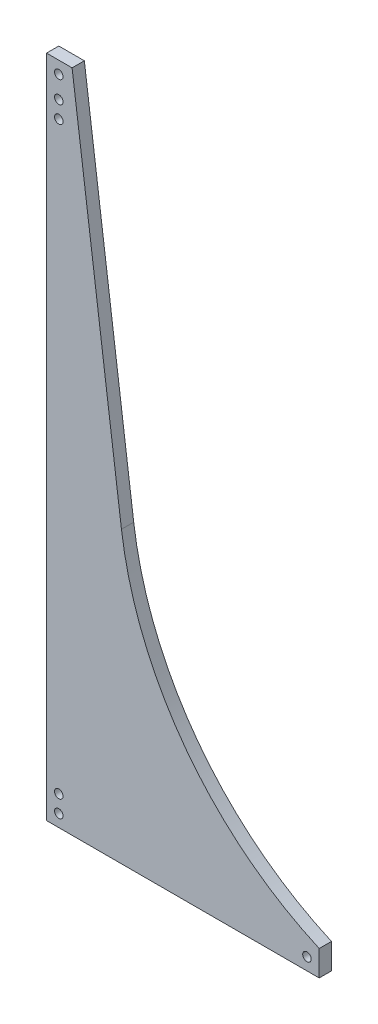
ISO-10303-21;
HEADER;
FILE_DESCRIPTION(('STEP AP214'),'2;1');
FILE_NAME('part.step','',(''),(''),'','','');
FILE_SCHEMA(('AUTOMOTIVE_DESIGN { 1 0 10303 214 1 1 1 1 }'));
ENDSEC;
DATA;
#1=APPLICATION_CONTEXT('core data for automotive mechanical design processes');
#2=APPLICATION_PROTOCOL_DEFINITION('international standard','automotive_design',2000,#1);
#3=PRODUCT_CONTEXT('',#1,'mechanical');
#4=PRODUCT('Part','Part','',(#3));
#5=PRODUCT_RELATED_PRODUCT_CATEGORY('part','',(#4));
#6=PRODUCT_DEFINITION_FORMATION('','',#4);
#7=PRODUCT_DEFINITION_CONTEXT('part definition',#1,'design');
#8=PRODUCT_DEFINITION('design','',#6,#7);
#9=PRODUCT_DEFINITION_SHAPE('','',#8);
#10=(LENGTH_UNIT() NAMED_UNIT(*) SI_UNIT(.MILLI.,.METRE.));
#11=(NAMED_UNIT(*) PLANE_ANGLE_UNIT() SI_UNIT($,.RADIAN.));
#12=(NAMED_UNIT(*) SI_UNIT($,.STERADIAN.) SOLID_ANGLE_UNIT());
#13=UNCERTAINTY_MEASURE_WITH_UNIT(LENGTH_MEASURE(1.E-05),#10,'distance_accuracy_value','');
#14=(GEOMETRIC_REPRESENTATION_CONTEXT(3) GLOBAL_UNCERTAINTY_ASSIGNED_CONTEXT((#13)) GLOBAL_UNIT_ASSIGNED_CONTEXT((#10,
#11,#12)) REPRESENTATION_CONTEXT('',''));
#15=CARTESIAN_POINT('',(0.,0.,0.));
#16=DIRECTION('',(0.,0.,1.));
#17=DIRECTION('',(1.,0.,0.));
#18=AXIS2_PLACEMENT_3D('',#15,#16,#17);
#19=CARTESIAN_POINT('',(0.,0.,9.128125));
#20=DIRECTION('',(1.,0.,0.));
#21=DIRECTION('',(0.,0.,-1.));
#22=AXIS2_PLACEMENT_3D('',#19,#20,#21);
#23=PLANE('',#22);
#24=DIRECTION('',(0.,-1.,0.));
#25=VECTOR('',#24,1.);
#26=CARTESIAN_POINT('',(0.,0.,-9.128125));
#27=LINE('',#26,#25);
#28=CARTESIAN_POINT('',(0.,990.6,-9.128125));
#29=VERTEX_POINT('',#28);
#30=CARTESIAN_POINT('',(0.,0.,-9.128125));
#31=VERTEX_POINT('',#30);
#32=EDGE_CURVE('E128',#29,#31,#27,.T.);
#33=ORIENTED_EDGE('',*,*,#32,.T.);
#34=DIRECTION('',(0.,0.,-1.));
#35=VECTOR('',#34,1.);
#36=CARTESIAN_POINT('',(0.,0.,9.128125));
#37=LINE('',#36,#35);
#38=CARTESIAN_POINT('',(0.,0.,9.128125));
#39=VERTEX_POINT('',#38);
#40=EDGE_CURVE('E11',#39,#31,#37,.T.);
#41=ORIENTED_EDGE('',*,*,#40,.F.);
#42=DIRECTION('',(0.,-1.,0.));
#43=VECTOR('',#42,1.);
#44=CARTESIAN_POINT('',(0.,0.,9.128125));
#45=LINE('',#44,#43);
#46=CARTESIAN_POINT('',(0.,990.6,9.128125));
#47=VERTEX_POINT('',#46);
#48=EDGE_CURVE('E145',#47,#39,#45,.T.);
#49=ORIENTED_EDGE('',*,*,#48,.F.);
#50=DIRECTION('',(0.,0.,-1.));
#51=VECTOR('',#50,1.);
#52=CARTESIAN_POINT('',(0.,990.6,9.128125));
#53=LINE('',#52,#51);
#54=EDGE_CURVE('E124',#47,#29,#53,.T.);
#55=ORIENTED_EDGE('',*,*,#54,.T.);
#56=EDGE_LOOP('',(#33,#41,#49,#55));
#57=FACE_BOUND('',#56,.T.);
#58=ADVANCED_FACE('F39',(#57),#23,.F.);
#59=CARTESIAN_POINT('',(0.,0.,9.128125));
#60=DIRECTION('',(0.,1.,0.));
#61=DIRECTION('',(0.,0.,1.));
#62=AXIS2_PLACEMENT_3D('',#59,#60,#61);
#63=PLANE('',#62);
#64=DIRECTION('',(1.,0.,0.));
#65=VECTOR('',#64,1.);
#66=CARTESIAN_POINT('',(0.,0.,-9.128125));
#67=LINE('',#66,#65);
#68=CARTESIAN_POINT('',(406.4,0.,-9.128125));
#69=VERTEX_POINT('',#68);
#70=EDGE_CURVE('E132',#31,#69,#67,.T.);
#71=ORIENTED_EDGE('',*,*,#70,.T.);
#72=DIRECTION('',(0.,0.,-1.));
#73=VECTOR('',#72,1.);
#74=CARTESIAN_POINT('',(406.4,0.,9.128125));
#75=LINE('',#74,#73);
#76=CARTESIAN_POINT('',(406.4,0.,9.128125));
#77=VERTEX_POINT('',#76);
#78=EDGE_CURVE('E48',#77,#69,#75,.T.);
#79=ORIENTED_EDGE('',*,*,#78,.F.);
#80=DIRECTION('',(1.,0.,0.));
#81=VECTOR('',#80,1.);
#82=CARTESIAN_POINT('',(0.,0.,9.128125));
#83=LINE('',#82,#81);
#84=EDGE_CURVE('E93',#39,#77,#83,.T.);
#85=ORIENTED_EDGE('',*,*,#84,.F.);
#86=ORIENTED_EDGE('',*,*,#40,.T.);
#87=EDGE_LOOP('',(#71,#79,#85,#86));
#88=FACE_BOUND('',#87,.T.);
#89=ADVANCED_FACE('F174',(#88),#63,.F.);
#90=CARTESIAN_POINT('',(406.4,0.,9.128125));
#91=DIRECTION('',(-1.,0.,0.));
#92=DIRECTION('',(0.,0.,1.));
#93=AXIS2_PLACEMENT_3D('',#90,#91,#92);
#94=PLANE('',#93);
#95=DIRECTION('',(0.,1.,0.));
#96=VECTOR('',#95,1.);
#97=CARTESIAN_POINT('',(406.4,0.,-9.128125));
#98=LINE('',#97,#96);
#99=CARTESIAN_POINT('',(406.4,38.1,-9.128125));
#100=VERTEX_POINT('',#99);
#101=EDGE_CURVE('E136',#69,#100,#98,.T.);
#102=ORIENTED_EDGE('',*,*,#101,.T.);
#103=DIRECTION('',(0.,0.,-1.));
#104=VECTOR('',#103,1.);
#105=CARTESIAN_POINT('',(406.4,38.1,9.128125));
#106=LINE('',#105,#104);
#107=CARTESIAN_POINT('',(406.4,38.1,9.128125));
#108=VERTEX_POINT('',#107);
#109=EDGE_CURVE('E117',#108,#100,#106,.T.);
#110=ORIENTED_EDGE('',*,*,#109,.F.);
#111=DIRECTION('',(0.,1.,0.));
#112=VECTOR('',#111,1.);
#113=CARTESIAN_POINT('',(406.4,0.,9.128125));
#114=LINE('',#113,#112);
#115=EDGE_CURVE('E106',#77,#108,#114,.T.);
#116=ORIENTED_EDGE('',*,*,#115,.F.);
#117=ORIENTED_EDGE('',*,*,#78,.T.);
#118=EDGE_LOOP('',(#102,#110,#116,#117));
#119=FACE_BOUND('',#118,.T.);
#120=ADVANCED_FACE('F155',(#119),#94,.F.);
#121=CARTESIAN_POINT('',(609.538956344785,497.34603180991,9.128125));
#122=DIRECTION('',(0.,0.,-1.));
#123=DIRECTION('',(-1.,0.,0.));
#124=AXIS2_PLACEMENT_3D('',#121,#122,#123);
#125=CYLINDRICAL_SURFACE('',#124,502.167654591569);
#126=CARTESIAN_POINT('',(609.538956344785,497.34603180991,-9.128125));
#127=DIRECTION('',(0.,0.,-1.));
#128=DIRECTION('',(-1.,0.,0.));
#129=AXIS2_PLACEMENT_3D('',#126,#127,#128);
#130=CIRCLE('',#129,502.167654591569);
#131=CARTESIAN_POINT('',(111.667415651835,431.8,-9.128125));
#132=VERTEX_POINT('',#131);
#133=EDGE_CURVE('E115',#100,#132,#130,.T.);
#134=ORIENTED_EDGE('',*,*,#133,.T.);
#135=DIRECTION('',(0.,0.,-1.));
#136=VECTOR('',#135,1.);
#137=CARTESIAN_POINT('',(111.667415651835,431.8,9.128125));
#138=LINE('',#137,#136);
#139=CARTESIAN_POINT('',(111.667415651835,431.8,9.128125));
#140=VERTEX_POINT('',#139);
#141=EDGE_CURVE('E112',#140,#132,#138,.T.);
#142=ORIENTED_EDGE('',*,*,#141,.F.);
#143=CARTESIAN_POINT('',(609.538956344785,497.34603180991,9.128125));
#144=DIRECTION('',(0.,0.,-1.));
#145=DIRECTION('',(-1.,0.,0.));
#146=AXIS2_PLACEMENT_3D('',#143,#144,#145);
#147=CIRCLE('',#146,502.167654591569);
#148=EDGE_CURVE('E100',#108,#140,#147,.T.);
#149=ORIENTED_EDGE('',*,*,#148,.F.);
#150=ORIENTED_EDGE('',*,*,#109,.T.);
#151=EDGE_LOOP('',(#134,#142,#149,#150));
#152=FACE_BOUND('',#151,.T.);
#153=ADVANCED_FACE('F113',(#152),#125,.F.);
#154=CARTESIAN_POINT('',(38.1,990.6,9.128125));
#155=DIRECTION('',(-0.991444861373811,-0.130526192220048,0.));
#156=DIRECTION('',(0.130526192220048,-0.991444861373811,0.));
#157=AXIS2_PLACEMENT_3D('',#154,#155,#156);
#158=PLANE('',#157);
#159=DIRECTION('',(-0.130526192220048,0.991444861373811,0.));
#160=VECTOR('',#159,1.);
#161=CARTESIAN_POINT('',(38.1,990.6,-9.128125));
#162=LINE('',#161,#160);
#163=CARTESIAN_POINT('',(38.1,990.6,-9.128125));
#164=VERTEX_POINT('',#163);
#165=EDGE_CURVE('E79',#132,#164,#162,.T.);
#166=ORIENTED_EDGE('',*,*,#165,.T.);
#167=DIRECTION('',(0.,0.,-1.));
#168=VECTOR('',#167,1.);
#169=CARTESIAN_POINT('',(38.1,990.6,9.128125));
#170=LINE('',#169,#168);
#171=CARTESIAN_POINT('',(38.1,990.6,9.128125));
#172=VERTEX_POINT('',#171);
#173=EDGE_CURVE('E118',#172,#164,#170,.T.);
#174=ORIENTED_EDGE('',*,*,#173,.F.);
#175=DIRECTION('',(-0.130526192220048,0.991444861373811,0.));
#176=VECTOR('',#175,1.);
#177=CARTESIAN_POINT('',(38.1,990.6,9.128125));
#178=LINE('',#177,#176);
#179=EDGE_CURVE('E104',#140,#172,#178,.T.);
#180=ORIENTED_EDGE('',*,*,#179,.F.);
#181=ORIENTED_EDGE('',*,*,#141,.T.);
#182=EDGE_LOOP('',(#166,#174,#180,#181));
#183=FACE_BOUND('',#182,.T.);
#184=ADVANCED_FACE('F120',(#183),#158,.F.);
#185=CARTESIAN_POINT('',(0.,990.6,9.128125));
#186=DIRECTION('',(0.,-1.,0.));
#187=DIRECTION('',(1.,0.,0.));
#188=AXIS2_PLACEMENT_3D('',#185,#186,#187);
#189=PLANE('',#188);
#190=DIRECTION('',(-1.,0.,0.));
#191=VECTOR('',#190,1.);
#192=CARTESIAN_POINT('',(0.,990.6,-9.128125));
#193=LINE('',#192,#191);
#194=EDGE_CURVE('E85',#164,#29,#193,.T.);
#195=ORIENTED_EDGE('',*,*,#194,.T.);
#196=ORIENTED_EDGE('',*,*,#54,.F.);
#197=DIRECTION('',(-1.,0.,0.));
#198=VECTOR('',#197,1.);
#199=CARTESIAN_POINT('',(0.,990.6,9.128125));
#200=LINE('',#199,#198);
#201=EDGE_CURVE('E56',#172,#47,#200,.T.);
#202=ORIENTED_EDGE('',*,*,#201,.F.);
#203=ORIENTED_EDGE('',*,*,#173,.T.);
#204=EDGE_LOOP('',(#195,#196,#202,#203));
#205=FACE_BOUND('',#204,.T.);
#206=ADVANCED_FACE('F162',(#205),#189,.F.);
#207=CARTESIAN_POINT('',(609.538956344785,497.34603180991,9.128125));
#208=DIRECTION('',(0.,0.,-1.));
#209=DIRECTION('',(-1.,0.,0.));
#210=AXIS2_PLACEMENT_3D('',#207,#208,#209);
#211=PLANE('',#210);
#212=CARTESIAN_POINT('',(18.25625,972.34375,9.128125));
#213=DIRECTION('',(0.,0.,1.));
#214=DIRECTION('',(1.,0.,0.));
#215=AXIS2_PLACEMENT_3D('',#212,#213,#214);
#216=CIRCLE('',#215,6.35);
#217=CARTESIAN_POINT('',(24.60625,972.34375,9.128125));
#218=VERTEX_POINT('',#217);
#219=EDGE_CURVE('E279',#218,#218,#216,.T.);
#220=ORIENTED_EDGE('',*,*,#219,.F.);
#221=EDGE_LOOP('',(#220));
#222=FACE_BOUND('',#221,.T.);
#223=CARTESIAN_POINT('',(18.25625,914.4,9.128125));
#224=DIRECTION('',(0.,0.,1.));
#225=DIRECTION('',(1.,0.,0.));
#226=AXIS2_PLACEMENT_3D('',#223,#224,#225);
#227=CIRCLE('',#226,6.35);
#228=CARTESIAN_POINT('',(24.60625,914.4,9.128125));
#229=VERTEX_POINT('',#228);
#230=EDGE_CURVE('E295',#229,#229,#227,.T.);
#231=ORIENTED_EDGE('',*,*,#230,.F.);
#232=EDGE_LOOP('',(#231));
#233=FACE_BOUND('',#232,.T.);
#234=CARTESIAN_POINT('',(18.25625,939.8,9.128125));
#235=DIRECTION('',(0.,0.,1.));
#236=DIRECTION('',(1.,0.,0.));
#237=AXIS2_PLACEMENT_3D('',#234,#235,#236);
#238=CIRCLE('',#237,6.35);
#239=CARTESIAN_POINT('',(24.60625,939.8,9.128125));
#240=VERTEX_POINT('',#239);
#241=EDGE_CURVE('E294',#240,#240,#238,.T.);
#242=ORIENTED_EDGE('',*,*,#241,.F.);
#243=EDGE_LOOP('',(#242));
#244=FACE_BOUND('',#243,.T.);
#245=CARTESIAN_POINT('',(18.25625,43.65625,9.128125));
#246=DIRECTION('',(0.,0.,1.));
#247=DIRECTION('',(1.,0.,0.));
#248=AXIS2_PLACEMENT_3D('',#245,#246,#247);
#249=CIRCLE('',#248,6.35);
#250=CARTESIAN_POINT('',(24.60625,43.65625,9.128125));
#251=VERTEX_POINT('',#250);
#252=EDGE_CURVE('E314',#251,#251,#249,.T.);
#253=ORIENTED_EDGE('',*,*,#252,.F.);
#254=EDGE_LOOP('',(#253));
#255=FACE_BOUND('',#254,.T.);
#256=CARTESIAN_POINT('',(388.14375,18.25625,9.128125));
#257=DIRECTION('',(0.,0.,1.));
#258=DIRECTION('',(1.,0.,0.));
#259=AXIS2_PLACEMENT_3D('',#256,#257,#258);
#260=CIRCLE('',#259,6.34999999999994);
#261=CARTESIAN_POINT('',(394.49375,18.25625,9.128125));
#262=VERTEX_POINT('',#261);
#263=EDGE_CURVE('E306',#262,#262,#260,.T.);
#264=ORIENTED_EDGE('',*,*,#263,.F.);
#265=EDGE_LOOP('',(#264));
#266=FACE_BOUND('',#265,.T.);
#267=CARTESIAN_POINT('',(18.25625,18.25625,9.128125));
#268=DIRECTION('',(0.,0.,1.));
#269=DIRECTION('',(1.,0.,0.));
#270=AXIS2_PLACEMENT_3D('',#267,#268,#269);
#271=CIRCLE('',#270,6.35);
#272=CARTESIAN_POINT('',(24.60625,18.25625,9.128125));
#273=VERTEX_POINT('',#272);
#274=EDGE_CURVE('E287',#273,#273,#271,.T.);
#275=ORIENTED_EDGE('',*,*,#274,.F.);
#276=EDGE_LOOP('',(#275));
#277=FACE_BOUND('',#276,.T.);
#278=ORIENTED_EDGE('',*,*,#48,.T.);
#279=ORIENTED_EDGE('',*,*,#84,.T.);
#280=ORIENTED_EDGE('',*,*,#115,.T.);
#281=ORIENTED_EDGE('',*,*,#148,.T.);
#282=ORIENTED_EDGE('',*,*,#179,.T.);
#283=ORIENTED_EDGE('',*,*,#201,.T.);
#284=EDGE_LOOP('',(#278,#279,#280,#281,#282,#283));
#285=FACE_BOUND('',#284,.T.);
#286=ADVANCED_FACE('F102',(#222,#233,#244,#255,#266,#277,#285),#211,.F.);
#287=CARTESIAN_POINT('',(609.538956344785,497.34603180991,-9.128125));
#288=DIRECTION('',(0.,0.,-1.));
#289=DIRECTION('',(-1.,0.,0.));
#290=AXIS2_PLACEMENT_3D('',#287,#288,#289);
#291=PLANE('',#290);
#292=CARTESIAN_POINT('',(18.25625,972.34375,-9.128125));
#293=DIRECTION('',(0.,0.,1.));
#294=DIRECTION('',(1.,0.,0.));
#295=AXIS2_PLACEMENT_3D('',#292,#293,#294);
#296=CIRCLE('',#295,6.35);
#297=CARTESIAN_POINT('',(24.60625,972.34375,-9.128125));
#298=VERTEX_POINT('',#297);
#299=EDGE_CURVE('E133',#298,#298,#296,.T.);
#300=ORIENTED_EDGE('',*,*,#299,.T.);
#301=EDGE_LOOP('',(#300));
#302=FACE_BOUND('',#301,.T.);
#303=CARTESIAN_POINT('',(18.25625,914.4,-9.128125));
#304=DIRECTION('',(0.,0.,1.));
#305=DIRECTION('',(1.,0.,0.));
#306=AXIS2_PLACEMENT_3D('',#303,#304,#305);
#307=CIRCLE('',#306,6.35);
#308=CARTESIAN_POINT('',(24.60625,914.4,-9.128125));
#309=VERTEX_POINT('',#308);
#310=EDGE_CURVE('E290',#309,#309,#307,.T.);
#311=ORIENTED_EDGE('',*,*,#310,.T.);
#312=EDGE_LOOP('',(#311));
#313=FACE_BOUND('',#312,.T.);
#314=CARTESIAN_POINT('',(18.25625,939.8,-9.128125));
#315=DIRECTION('',(0.,0.,1.));
#316=DIRECTION('',(1.,0.,0.));
#317=AXIS2_PLACEMENT_3D('',#314,#315,#316);
#318=CIRCLE('',#317,6.35);
#319=CARTESIAN_POINT('',(24.60625,939.8,-9.128125));
#320=VERTEX_POINT('',#319);
#321=EDGE_CURVE('E318',#320,#320,#318,.T.);
#322=ORIENTED_EDGE('',*,*,#321,.T.);
#323=EDGE_LOOP('',(#322));
#324=FACE_BOUND('',#323,.T.);
#325=CARTESIAN_POINT('',(18.25625,43.65625,-9.128125));
#326=DIRECTION('',(0.,0.,1.));
#327=DIRECTION('',(1.,0.,0.));
#328=AXIS2_PLACEMENT_3D('',#325,#326,#327);
#329=CIRCLE('',#328,6.35);
#330=CARTESIAN_POINT('',(24.60625,43.65625,-9.128125));
#331=VERTEX_POINT('',#330);
#332=EDGE_CURVE('E310',#331,#331,#329,.T.);
#333=ORIENTED_EDGE('',*,*,#332,.T.);
#334=EDGE_LOOP('',(#333));
#335=FACE_BOUND('',#334,.T.);
#336=CARTESIAN_POINT('',(388.14375,18.25625,-9.128125));
#337=DIRECTION('',(0.,0.,1.));
#338=DIRECTION('',(1.,0.,0.));
#339=AXIS2_PLACEMENT_3D('',#336,#337,#338);
#340=CIRCLE('',#339,6.34999999999994);
#341=CARTESIAN_POINT('',(394.49375,18.25625,-9.128125));
#342=VERTEX_POINT('',#341);
#343=EDGE_CURVE('E302',#342,#342,#340,.T.);
#344=ORIENTED_EDGE('',*,*,#343,.T.);
#345=EDGE_LOOP('',(#344));
#346=FACE_BOUND('',#345,.T.);
#347=CARTESIAN_POINT('',(18.25625,18.25625,-9.128125));
#348=DIRECTION('',(0.,0.,1.));
#349=DIRECTION('',(1.,0.,0.));
#350=AXIS2_PLACEMENT_3D('',#347,#348,#349);
#351=CIRCLE('',#350,6.35);
#352=CARTESIAN_POINT('',(24.60625,18.25625,-9.128125));
#353=VERTEX_POINT('',#352);
#354=EDGE_CURVE('E281',#353,#353,#351,.T.);
#355=ORIENTED_EDGE('',*,*,#354,.T.);
#356=EDGE_LOOP('',(#355));
#357=FACE_BOUND('',#356,.T.);
#358=ORIENTED_EDGE('',*,*,#32,.F.);
#359=ORIENTED_EDGE('',*,*,#194,.F.);
#360=ORIENTED_EDGE('',*,*,#165,.F.);
#361=ORIENTED_EDGE('',*,*,#133,.F.);
#362=ORIENTED_EDGE('',*,*,#101,.F.);
#363=ORIENTED_EDGE('',*,*,#70,.F.);
#364=EDGE_LOOP('',(#358,#359,#360,#361,#362,#363));
#365=FACE_BOUND('',#364,.T.);
#366=ADVANCED_FACE('F158',(#302,#313,#324,#335,#346,#357,#365),#291,.T.);
#367=CARTESIAN_POINT('',(18.25625,18.25625,-9.128125));
#368=DIRECTION('',(0.,0.,1.));
#369=DIRECTION('',(1.,0.,0.));
#370=AXIS2_PLACEMENT_3D('',#367,#368,#369);
#371=CYLINDRICAL_SURFACE('',#370,6.35);
#372=ORIENTED_EDGE('',*,*,#354,.F.);
#373=EDGE_LOOP('',(#372));
#374=FACE_BOUND('',#373,.T.);
#375=ORIENTED_EDGE('',*,*,#274,.T.);
#376=EDGE_LOOP('',(#375));
#377=FACE_BOUND('',#376,.T.);
#378=ADVANCED_FACE('F211',(#374,#377),#371,.F.);
#379=CARTESIAN_POINT('',(388.14375,18.25625,-9.128125));
#380=DIRECTION('',(0.,0.,1.));
#381=DIRECTION('',(1.,0.,0.));
#382=AXIS2_PLACEMENT_3D('',#379,#380,#381);
#383=CYLINDRICAL_SURFACE('',#382,6.34999999999994);
#384=ORIENTED_EDGE('',*,*,#343,.F.);
#385=EDGE_LOOP('',(#384));
#386=FACE_BOUND('',#385,.T.);
#387=ORIENTED_EDGE('',*,*,#263,.T.);
#388=EDGE_LOOP('',(#387));
#389=FACE_BOUND('',#388,.T.);
#390=ADVANCED_FACE('F220',(#386,#389),#383,.F.);
#391=CARTESIAN_POINT('',(18.25625,43.65625,-9.128125));
#392=DIRECTION('',(0.,0.,1.));
#393=DIRECTION('',(1.,0.,0.));
#394=AXIS2_PLACEMENT_3D('',#391,#392,#393);
#395=CYLINDRICAL_SURFACE('',#394,6.35);
#396=ORIENTED_EDGE('',*,*,#332,.F.);
#397=EDGE_LOOP('',(#396));
#398=FACE_BOUND('',#397,.T.);
#399=ORIENTED_EDGE('',*,*,#252,.T.);
#400=EDGE_LOOP('',(#399));
#401=FACE_BOUND('',#400,.T.);
#402=ADVANCED_FACE('F230',(#398,#401),#395,.F.);
#403=CARTESIAN_POINT('',(18.25625,939.8,-9.128125));
#404=DIRECTION('',(0.,0.,1.));
#405=DIRECTION('',(1.,0.,0.));
#406=AXIS2_PLACEMENT_3D('',#403,#404,#405);
#407=CYLINDRICAL_SURFACE('',#406,6.35);
#408=ORIENTED_EDGE('',*,*,#321,.F.);
#409=EDGE_LOOP('',(#408));
#410=FACE_BOUND('',#409,.T.);
#411=ORIENTED_EDGE('',*,*,#241,.T.);
#412=EDGE_LOOP('',(#411));
#413=FACE_BOUND('',#412,.T.);
#414=ADVANCED_FACE('F240',(#410,#413),#407,.F.);
#415=CARTESIAN_POINT('',(18.25625,914.4,-9.128125));
#416=DIRECTION('',(0.,0.,1.));
#417=DIRECTION('',(1.,0.,0.));
#418=AXIS2_PLACEMENT_3D('',#415,#416,#417);
#419=CYLINDRICAL_SURFACE('',#418,6.35);
#420=ORIENTED_EDGE('',*,*,#310,.F.);
#421=EDGE_LOOP('',(#420));
#422=FACE_BOUND('',#421,.T.);
#423=ORIENTED_EDGE('',*,*,#230,.T.);
#424=EDGE_LOOP('',(#423));
#425=FACE_BOUND('',#424,.T.);
#426=ADVANCED_FACE('F250',(#422,#425),#419,.F.);
#427=CARTESIAN_POINT('',(18.25625,972.34375,-9.128125));
#428=DIRECTION('',(0.,0.,1.));
#429=DIRECTION('',(1.,0.,0.));
#430=AXIS2_PLACEMENT_3D('',#427,#428,#429);
#431=CYLINDRICAL_SURFACE('',#430,6.35);
#432=ORIENTED_EDGE('',*,*,#299,.F.);
#433=EDGE_LOOP('',(#432));
#434=FACE_BOUND('',#433,.T.);
#435=ORIENTED_EDGE('',*,*,#219,.T.);
#436=EDGE_LOOP('',(#435));
#437=FACE_BOUND('',#436,.T.);
#438=ADVANCED_FACE('F260',(#434,#437),#431,.F.);
#439=CLOSED_SHELL('',(#58,#89,#120,#153,#184,#206,#286,#366,#378,#390,#402,#414,#426,#438));
#440=MANIFOLD_SOLID_BREP('B2',#439);
#441=ADVANCED_BREP_SHAPE_REPRESENTATION('',(#18,#440),#14);
#442=SHAPE_DEFINITION_REPRESENTATION(#9,#441);
ENDSEC;
END-ISO-10303-21;
